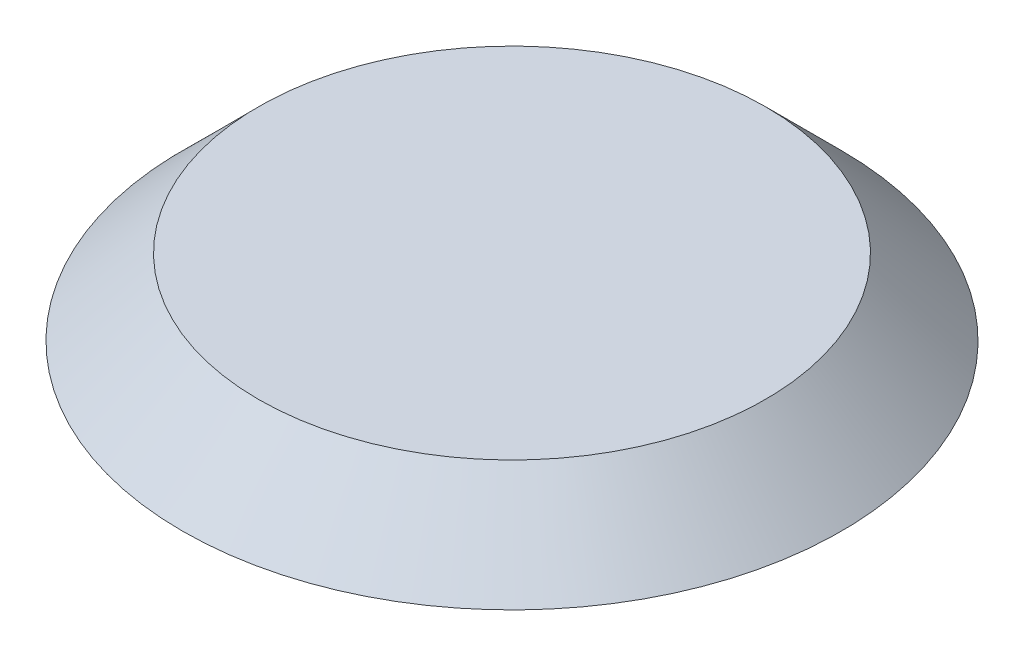
ISO-10303-21;
HEADER;
FILE_DESCRIPTION(('STEP AP214'),'2;1');
FILE_NAME('part.step','',(''),(''),'','','');
FILE_SCHEMA(('AUTOMOTIVE_DESIGN { 1 0 10303 214 1 1 1 1 }'));
ENDSEC;
DATA;
#1=APPLICATION_CONTEXT('core data for automotive mechanical design processes');
#2=APPLICATION_PROTOCOL_DEFINITION('international standard','automotive_design',2000,#1);
#3=PRODUCT_CONTEXT('',#1,'mechanical');
#4=PRODUCT('Part','Part','',(#3));
#5=PRODUCT_RELATED_PRODUCT_CATEGORY('part','',(#4));
#6=PRODUCT_DEFINITION_FORMATION('','',#4);
#7=PRODUCT_DEFINITION_CONTEXT('part definition',#1,'design');
#8=PRODUCT_DEFINITION('design','',#6,#7);
#9=PRODUCT_DEFINITION_SHAPE('','',#8);
#10=(LENGTH_UNIT() NAMED_UNIT(*) SI_UNIT(.MILLI.,.METRE.));
#11=(NAMED_UNIT(*) PLANE_ANGLE_UNIT() SI_UNIT($,.RADIAN.));
#12=(NAMED_UNIT(*) SI_UNIT($,.STERADIAN.) SOLID_ANGLE_UNIT());
#13=UNCERTAINTY_MEASURE_WITH_UNIT(LENGTH_MEASURE(1.E-05),#10,'distance_accuracy_value','');
#14=(GEOMETRIC_REPRESENTATION_CONTEXT(3) GLOBAL_UNCERTAINTY_ASSIGNED_CONTEXT((#13)) GLOBAL_UNIT_ASSIGNED_CONTEXT((#10,
#11,#12)) REPRESENTATION_CONTEXT('',''));
#15=CARTESIAN_POINT('',(0.,0.,0.));
#16=DIRECTION('',(0.,0.,1.));
#17=DIRECTION('',(1.,0.,0.));
#18=AXIS2_PLACEMENT_3D('',#15,#16,#17);
#19=CARTESIAN_POINT('',(0.,3.,0.));
#20=DIRECTION('',(0.,1.,0.));
#21=DIRECTION('',(0.,0.,1.));
#22=AXIS2_PLACEMENT_3D('',#19,#20,#21);
#23=PLANE('',#22);
#24=CARTESIAN_POINT('',(0.,3.,0.));
#25=DIRECTION('',(0.,1.,0.));
#26=DIRECTION('',(0.,0.,1.));
#27=AXIS2_PLACEMENT_3D('',#24,#25,#26);
#28=CIRCLE('',#27,10.);
#29=CARTESIAN_POINT('',(0.,3.,10.));
#30=VERTEX_POINT('',#29);
#31=EDGE_CURVE('E10',#30,#30,#28,.T.);
#32=ORIENTED_EDGE('',*,*,#31,.T.);
#33=EDGE_LOOP('',(#32));
#34=FACE_BOUND('',#33,.T.);
#35=ADVANCED_FACE('F31',(#34),#23,.T.);
#36=CARTESIAN_POINT('',(0.,0.,0.));
#37=DIRECTION('',(0.,1.,0.));
#38=DIRECTION('',(0.,0.,1.));
#39=AXIS2_PLACEMENT_3D('',#36,#37,#38);
#40=PLANE('',#39);
#41=CARTESIAN_POINT('',(0.,0.,0.));
#42=DIRECTION('',(0.,1.,0.));
#43=DIRECTION('',(0.,0.,1.));
#44=AXIS2_PLACEMENT_3D('',#41,#42,#43);
#45=CIRCLE('',#44,13.);
#46=CARTESIAN_POINT('',(0.,0.,13.));
#47=VERTEX_POINT('',#46);
#48=EDGE_CURVE('E38',#47,#47,#45,.T.);
#49=ORIENTED_EDGE('',*,*,#48,.F.);
#50=EDGE_LOOP('',(#49));
#51=FACE_BOUND('',#50,.T.);
#52=ADVANCED_FACE('F46',(#51),#40,.F.);
#53=CARTESIAN_POINT('',(0.,3.,0.));
#54=DIRECTION('',(0.,-1.,0.));
#55=DIRECTION('',(0.,0.,-1.));
#56=AXIS2_PLACEMENT_3D('',#53,#54,#55);
#57=CONICAL_SURFACE('',#56,10.,0.785398163397447);
#58=ORIENTED_EDGE('',*,*,#48,.T.);
#59=EDGE_LOOP('',(#58));
#60=FACE_BOUND('',#59,.T.);
#61=ORIENTED_EDGE('',*,*,#31,.F.);
#62=EDGE_LOOP('',(#61));
#63=FACE_BOUND('',#62,.T.);
#64=ADVANCED_FACE('F33',(#60,#63),#57,.T.);
#65=CLOSED_SHELL('',(#35,#52,#64));
#66=MANIFOLD_SOLID_BREP('B2',#65);
#67=ADVANCED_BREP_SHAPE_REPRESENTATION('',(#18,#66),#14);
#68=SHAPE_DEFINITION_REPRESENTATION(#9,#67);
ENDSEC;
END-ISO-10303-21;
